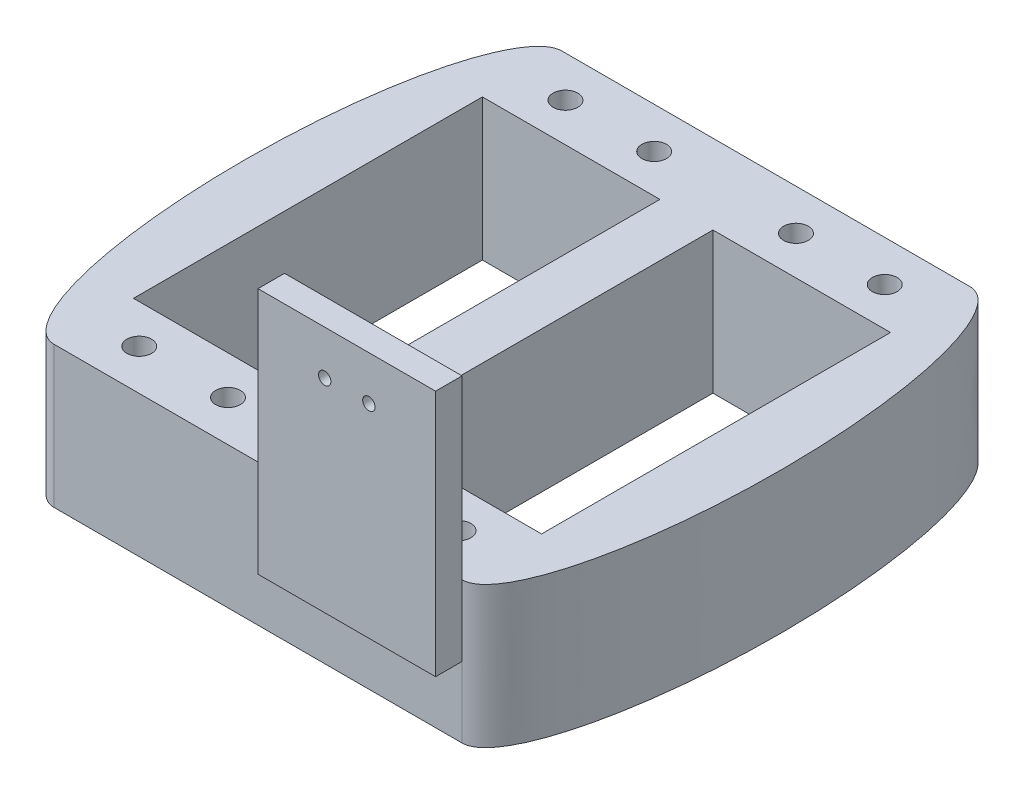
ISO-10303-21;
HEADER;
FILE_DESCRIPTION(('STEP AP214'),'2;1');
FILE_NAME('part.step','',(''),(''),'','','');
FILE_SCHEMA(('AUTOMOTIVE_DESIGN { 1 0 10303 214 1 1 1 1 }'));
ENDSEC;
DATA;
#1=APPLICATION_CONTEXT('core data for automotive mechanical design processes');
#2=APPLICATION_PROTOCOL_DEFINITION('international standard','automotive_design',2000,#1);
#3=PRODUCT_CONTEXT('',#1,'mechanical');
#4=PRODUCT('Part','Part','',(#3));
#5=PRODUCT_RELATED_PRODUCT_CATEGORY('part','',(#4));
#6=PRODUCT_DEFINITION_FORMATION('','',#4);
#7=PRODUCT_DEFINITION_CONTEXT('part definition',#1,'design');
#8=PRODUCT_DEFINITION('design','',#6,#7);
#9=PRODUCT_DEFINITION_SHAPE('','',#8);
#10=(LENGTH_UNIT() NAMED_UNIT(*) SI_UNIT(.MILLI.,.METRE.));
#11=(NAMED_UNIT(*) PLANE_ANGLE_UNIT() SI_UNIT($,.RADIAN.));
#12=(NAMED_UNIT(*) SI_UNIT($,.STERADIAN.) SOLID_ANGLE_UNIT());
#13=UNCERTAINTY_MEASURE_WITH_UNIT(LENGTH_MEASURE(1.E-05),#10,'distance_accuracy_value','');
#14=(GEOMETRIC_REPRESENTATION_CONTEXT(3) GLOBAL_UNCERTAINTY_ASSIGNED_CONTEXT((#13)) GLOBAL_UNIT_ASSIGNED_CONTEXT((#10,
#11,#12)) REPRESENTATION_CONTEXT('',''));
#15=CARTESIAN_POINT('',(0.,0.,0.));
#16=DIRECTION('',(0.,0.,1.));
#17=DIRECTION('',(1.,0.,0.));
#18=AXIS2_PLACEMENT_3D('',#15,#16,#17);
#19=CARTESIAN_POINT('',(0.,-8.,28.75));
#20=DIRECTION('',(0.,0.,1.));
#21=DIRECTION('',(1.,0.,0.));
#22=AXIS2_PLACEMENT_3D('',#19,#20,#21);
#23=PLANE('',#22);
#24=DIRECTION('',(-1.,0.,0.));
#25=VECTOR('',#24,1.);
#26=CARTESIAN_POINT('',(0.,0.,28.75));
#27=LINE('',#26,#25);
#28=CARTESIAN_POINT('',(10.05,0.,28.75));
#29=VERTEX_POINT('',#28);
#30=CARTESIAN_POINT('',(-10.05,0.,28.75));
#31=VERTEX_POINT('',#30);
#32=EDGE_CURVE('E339',#29,#31,#27,.T.);
#33=ORIENTED_EDGE('',*,*,#32,.T.);
#34=DIRECTION('',(0.,-1.,0.));
#35=VECTOR('',#34,1.);
#36=CARTESIAN_POINT('',(-10.05,28.,28.75));
#37=LINE('',#36,#35);
#38=CARTESIAN_POINT('',(-10.05,8.,28.75));
#39=VERTEX_POINT('',#38);
#40=EDGE_CURVE('E344',#39,#31,#37,.T.);
#41=ORIENTED_EDGE('',*,*,#40,.F.);
#42=DIRECTION('',(1.,0.,0.));
#43=VECTOR('',#42,1.);
#44=CARTESIAN_POINT('',(0.,8.,28.75));
#45=LINE('',#44,#43);
#46=CARTESIAN_POINT('',(-36.15,8.,28.75));
#47=VERTEX_POINT('',#46);
#48=EDGE_CURVE('E178',#47,#39,#45,.T.);
#49=ORIENTED_EDGE('',*,*,#48,.F.);
#50=DIRECTION('',(0.,1.,0.));
#51=VECTOR('',#50,1.);
#52=CARTESIAN_POINT('',(-36.15,-8.,28.75));
#53=LINE('',#52,#51);
#54=CARTESIAN_POINT('',(-36.15,-8.,28.75));
#55=VERTEX_POINT('',#54);
#56=EDGE_CURVE('E326',#55,#47,#53,.T.);
#57=ORIENTED_EDGE('',*,*,#56,.F.);
#58=DIRECTION('',(1.,0.,0.));
#59=VECTOR('',#58,1.);
#60=CARTESIAN_POINT('',(0.,-8.,28.75));
#61=LINE('',#60,#59);
#62=CARTESIAN_POINT('',(10.05,-8.,28.75));
#63=VERTEX_POINT('',#62);
#64=EDGE_CURVE('E242',#55,#63,#61,.T.);
#65=ORIENTED_EDGE('',*,*,#64,.T.);
#66=DIRECTION('',(0.,1.,0.));
#67=VECTOR('',#66,1.);
#68=CARTESIAN_POINT('',(10.05,-8.,28.75));
#69=LINE('',#68,#67);
#70=EDGE_CURVE('E37',#63,#29,#69,.T.);
#71=ORIENTED_EDGE('',*,*,#70,.T.);
#72=EDGE_LOOP('',(#33,#41,#49,#57,#65,#71));
#73=FACE_BOUND('',#72,.T.);
#74=ADVANCED_FACE('F34',(#73),#23,.T.);
#75=CARTESIAN_POINT('',(-36.15,-8.,0.));
#76=DIRECTION('',(1.,0.,0.));
#77=DIRECTION('',(0.,0.,-1.));
#78=AXIS2_PLACEMENT_3D('',#75,#76,#77);
#79=PLANE('',#78);
#80=DIRECTION('',(0.,1.,0.));
#81=VECTOR('',#80,1.);
#82=CARTESIAN_POINT('',(-36.15,-8.,-19.75));
#83=LINE('',#82,#81);
#84=CARTESIAN_POINT('',(-36.15,-8.,-19.75));
#85=VERTEX_POINT('',#84);
#86=CARTESIAN_POINT('',(-36.15,8.,-19.75));
#87=VERTEX_POINT('',#86);
#88=EDGE_CURVE('E316',#85,#87,#83,.T.);
#89=ORIENTED_EDGE('',*,*,#88,.T.);
#90=DIRECTION('',(0.,0.,-1.));
#91=VECTOR('',#90,1.);
#92=CARTESIAN_POINT('',(-36.15,8.,0.));
#93=LINE('',#92,#91);
#94=CARTESIAN_POINT('',(-36.15,8.,19.75));
#95=VERTEX_POINT('',#94);
#96=EDGE_CURVE('E206',#95,#87,#93,.T.);
#97=ORIENTED_EDGE('',*,*,#96,.F.);
#98=DIRECTION('',(0.,1.,0.));
#99=VECTOR('',#98,1.);
#100=CARTESIAN_POINT('',(-36.15,-8.,19.75));
#101=LINE('',#100,#99);
#102=CARTESIAN_POINT('',(-36.15,-8.,19.75));
#103=VERTEX_POINT('',#102);
#104=EDGE_CURVE('E11',#103,#95,#101,.T.);
#105=ORIENTED_EDGE('',*,*,#104,.F.);
#106=DIRECTION('',(0.,0.,-1.));
#107=VECTOR('',#106,1.);
#108=CARTESIAN_POINT('',(-36.15,-8.,0.));
#109=LINE('',#108,#107);
#110=EDGE_CURVE('E281',#103,#85,#109,.T.);
#111=ORIENTED_EDGE('',*,*,#110,.T.);
#112=EDGE_LOOP('',(#89,#97,#105,#111));
#113=FACE_BOUND('',#112,.T.);
#114=ADVANCED_FACE('F401',(#113),#79,.T.);
#115=CARTESIAN_POINT('',(0.,-8.,19.75));
#116=DIRECTION('',(0.,0.,1.));
#117=DIRECTION('',(1.,0.,0.));
#118=AXIS2_PLACEMENT_3D('',#115,#116,#117);
#119=PLANE('',#118);
#120=ORIENTED_EDGE('',*,*,#104,.T.);
#121=DIRECTION('',(1.,0.,0.));
#122=VECTOR('',#121,1.);
#123=CARTESIAN_POINT('',(0.,8.,19.75));
#124=LINE('',#123,#122);
#125=CARTESIAN_POINT('',(-16.05,8.,19.75));
#126=VERTEX_POINT('',#125);
#127=EDGE_CURVE('E215',#95,#126,#124,.T.);
#128=ORIENTED_EDGE('',*,*,#127,.T.);
#129=DIRECTION('',(0.,1.,0.));
#130=VECTOR('',#129,1.);
#131=CARTESIAN_POINT('',(-16.05,-8.,19.75));
#132=LINE('',#131,#130);
#133=CARTESIAN_POINT('',(-16.05,-8.,19.75));
#134=VERTEX_POINT('',#133);
#135=EDGE_CURVE('E42',#134,#126,#132,.T.);
#136=ORIENTED_EDGE('',*,*,#135,.F.);
#137=DIRECTION('',(1.,0.,0.));
#138=VECTOR('',#137,1.);
#139=CARTESIAN_POINT('',(0.,-8.,19.75));
#140=LINE('',#139,#138);
#141=EDGE_CURVE('E287',#103,#134,#140,.T.);
#142=ORIENTED_EDGE('',*,*,#141,.F.);
#143=EDGE_LOOP('',(#120,#128,#136,#142));
#144=FACE_BOUND('',#143,.T.);
#145=ADVANCED_FACE('F405',(#144),#119,.F.);
#146=CARTESIAN_POINT('',(-16.05,-8.,0.));
#147=DIRECTION('',(1.,0.,0.));
#148=DIRECTION('',(0.,0.,-1.));
#149=AXIS2_PLACEMENT_3D('',#146,#147,#148);
#150=PLANE('',#149);
#151=ORIENTED_EDGE('',*,*,#135,.T.);
#152=DIRECTION('',(0.,0.,-1.));
#153=VECTOR('',#152,1.);
#154=CARTESIAN_POINT('',(-16.05,8.,0.));
#155=LINE('',#154,#153);
#156=CARTESIAN_POINT('',(-16.05,8.,-19.75));
#157=VERTEX_POINT('',#156);
#158=EDGE_CURVE('E212',#126,#157,#155,.T.);
#159=ORIENTED_EDGE('',*,*,#158,.T.);
#160=DIRECTION('',(0.,1.,0.));
#161=VECTOR('',#160,1.);
#162=CARTESIAN_POINT('',(-16.05,-8.,-19.75));
#163=LINE('',#162,#161);
#164=CARTESIAN_POINT('',(-16.05,-8.,-19.75));
#165=VERTEX_POINT('',#164);
#166=EDGE_CURVE('E314',#165,#157,#163,.T.);
#167=ORIENTED_EDGE('',*,*,#166,.F.);
#168=DIRECTION('',(0.,0.,-1.));
#169=VECTOR('',#168,1.);
#170=CARTESIAN_POINT('',(-16.05,-8.,0.));
#171=LINE('',#170,#169);
#172=EDGE_CURVE('E56',#134,#165,#171,.T.);
#173=ORIENTED_EDGE('',*,*,#172,.F.);
#174=EDGE_LOOP('',(#151,#159,#167,#173));
#175=FACE_BOUND('',#174,.T.);
#176=ADVANCED_FACE('F410',(#175),#150,.F.);
#177=CARTESIAN_POINT('',(10.05,-8.,0.));
#178=DIRECTION('',(1.,0.,0.));
#179=DIRECTION('',(0.,0.,-1.));
#180=AXIS2_PLACEMENT_3D('',#177,#178,#179);
#181=PLANE('',#180);
#182=DIRECTION('',(0.,1.,0.));
#183=VECTOR('',#182,1.);
#184=CARTESIAN_POINT('',(10.05,-8.,19.75));
#185=LINE('',#184,#183);
#186=CARTESIAN_POINT('',(10.05,-8.,19.75));
#187=VERTEX_POINT('',#186);
#188=CARTESIAN_POINT('',(10.05,8.,19.75));
#189=VERTEX_POINT('',#188);
#190=EDGE_CURVE('E324',#187,#189,#185,.T.);
#191=ORIENTED_EDGE('',*,*,#190,.T.);
#192=DIRECTION('',(0.,0.,-1.));
#193=VECTOR('',#192,1.);
#194=CARTESIAN_POINT('',(10.05,8.,0.));
#195=LINE('',#194,#193);
#196=CARTESIAN_POINT('',(10.05,8.,-19.75));
#197=VERTEX_POINT('',#196);
#198=EDGE_CURVE('E194',#189,#197,#195,.T.);
#199=ORIENTED_EDGE('',*,*,#198,.T.);
#200=DIRECTION('',(0.,1.,0.));
#201=VECTOR('',#200,1.);
#202=CARTESIAN_POINT('',(10.05,-8.,-19.75));
#203=LINE('',#202,#201);
#204=CARTESIAN_POINT('',(10.05,-8.,-19.75));
#205=VERTEX_POINT('',#204);
#206=EDGE_CURVE('E318',#205,#197,#203,.T.);
#207=ORIENTED_EDGE('',*,*,#206,.F.);
#208=DIRECTION('',(0.,0.,-1.));
#209=VECTOR('',#208,1.);
#210=CARTESIAN_POINT('',(10.05,-8.,0.));
#211=LINE('',#210,#209);
#212=EDGE_CURVE('E272',#187,#205,#211,.T.);
#213=ORIENTED_EDGE('',*,*,#212,.F.);
#214=EDGE_LOOP('',(#191,#199,#207,#213));
#215=FACE_BOUND('',#214,.T.);
#216=ADVANCED_FACE('F266',(#215),#181,.F.);
#217=CARTESIAN_POINT('',(0.,-8.,-19.75));
#218=DIRECTION('',(0.,0.,1.));
#219=DIRECTION('',(1.,0.,0.));
#220=AXIS2_PLACEMENT_3D('',#217,#218,#219);
#221=PLANE('',#220);
#222=ORIENTED_EDGE('',*,*,#206,.T.);
#223=DIRECTION('',(1.,0.,0.));
#224=VECTOR('',#223,1.);
#225=CARTESIAN_POINT('',(0.,8.,-19.75));
#226=LINE('',#225,#224);
#227=CARTESIAN_POINT('',(-10.05,8.,-19.75));
#228=VERTEX_POINT('',#227);
#229=EDGE_CURVE('E203',#228,#197,#226,.T.);
#230=ORIENTED_EDGE('',*,*,#229,.F.);
#231=DIRECTION('',(0.,1.,0.));
#232=VECTOR('',#231,1.);
#233=CARTESIAN_POINT('',(-10.05,-8.,-19.75));
#234=LINE('',#233,#232);
#235=CARTESIAN_POINT('',(-10.05,-8.,-19.75));
#236=VERTEX_POINT('',#235);
#237=EDGE_CURVE('E320',#236,#228,#234,.T.);
#238=ORIENTED_EDGE('',*,*,#237,.F.);
#239=DIRECTION('',(1.,0.,0.));
#240=VECTOR('',#239,1.);
#241=CARTESIAN_POINT('',(0.,-8.,-19.75));
#242=LINE('',#241,#240);
#243=EDGE_CURVE('E278',#236,#205,#242,.T.);
#244=ORIENTED_EDGE('',*,*,#243,.T.);
#245=EDGE_LOOP('',(#222,#230,#238,#244));
#246=FACE_BOUND('',#245,.T.);
#247=ADVANCED_FACE('F417',(#246),#221,.T.);
#248=CARTESIAN_POINT('',(-10.05,-8.,0.));
#249=DIRECTION('',(-1.,0.,0.));
#250=DIRECTION('',(0.,0.,1.));
#251=AXIS2_PLACEMENT_3D('',#248,#249,#250);
#252=PLANE('',#251);
#253=ORIENTED_EDGE('',*,*,#237,.T.);
#254=DIRECTION('',(0.,0.,1.));
#255=VECTOR('',#254,1.);
#256=CARTESIAN_POINT('',(-10.05,8.,0.));
#257=LINE('',#256,#255);
#258=CARTESIAN_POINT('',(-10.05,8.,19.75));
#259=VERTEX_POINT('',#258);
#260=EDGE_CURVE('E200',#228,#259,#257,.T.);
#261=ORIENTED_EDGE('',*,*,#260,.T.);
#262=DIRECTION('',(0.,1.,0.));
#263=VECTOR('',#262,1.);
#264=CARTESIAN_POINT('',(-10.05,-8.,19.75));
#265=LINE('',#264,#263);
#266=CARTESIAN_POINT('',(-10.05,-8.,19.75));
#267=VERTEX_POINT('',#266);
#268=EDGE_CURVE('E322',#267,#259,#265,.T.);
#269=ORIENTED_EDGE('',*,*,#268,.F.);
#270=DIRECTION('',(0.,0.,1.));
#271=VECTOR('',#270,1.);
#272=CARTESIAN_POINT('',(-10.05,-8.,0.));
#273=LINE('',#272,#271);
#274=EDGE_CURVE('E276',#236,#267,#273,.T.);
#275=ORIENTED_EDGE('',*,*,#274,.F.);
#276=EDGE_LOOP('',(#253,#261,#269,#275));
#277=FACE_BOUND('',#276,.T.);
#278=ADVANCED_FACE('F264',(#277),#252,.F.);
#279=CARTESIAN_POINT('',(-36.15,-8.,0.));
#280=DIRECTION('',(0.,1.,0.));
#281=DIRECTION('',(0.,0.,-1.));
#282=AXIS2_PLACEMENT_3D('',#279,#280,#281);
#283=ELLIPSE('',#282,28.75,7.28237261118205);
#284=DIRECTION('',(0.,1.,0.));
#285=VECTOR('',#284,1.);
#286=SURFACE_OF_LINEAR_EXTRUSION('',#283,#285);
#287=ORIENTED_EDGE('',*,*,#56,.T.);
#288=CARTESIAN_POINT('',(-36.15,8.,0.));
#289=DIRECTION('',(0.,1.,0.));
#290=DIRECTION('',(0.,0.,-1.));
#291=AXIS2_PLACEMENT_3D('',#288,#289,#290);
#292=ELLIPSE('',#291,28.75,7.28237261118205);
#293=CARTESIAN_POINT('',(-36.15,8.,-28.75));
#294=VERTEX_POINT('',#293);
#295=EDGE_CURVE('E191',#294,#47,#292,.T.);
#296=ORIENTED_EDGE('',*,*,#295,.F.);
#297=DIRECTION('',(0.,1.,0.));
#298=VECTOR('',#297,1.);
#299=CARTESIAN_POINT('',(-36.15,-8.,-28.75));
#300=LINE('',#299,#298);
#301=CARTESIAN_POINT('',(-36.15,-8.,-28.75));
#302=VERTEX_POINT('',#301);
#303=EDGE_CURVE('E328',#302,#294,#300,.T.);
#304=ORIENTED_EDGE('',*,*,#303,.F.);
#305=EDGE_CURVE('E268',#302,#55,#283,.T.);
#306=ORIENTED_EDGE('',*,*,#305,.T.);
#307=EDGE_LOOP('',(#287,#296,#304,#306));
#308=FACE_BOUND('',#307,.T.);
#309=ADVANCED_FACE('F260',(#308),#286,.T.);
#310=CARTESIAN_POINT('',(0.,-8.,-28.75));
#311=DIRECTION('',(0.,0.,1.));
#312=DIRECTION('',(1.,0.,0.));
#313=AXIS2_PLACEMENT_3D('',#310,#311,#312);
#314=PLANE('',#313);
#315=ORIENTED_EDGE('',*,*,#303,.T.);
#316=DIRECTION('',(1.,0.,0.));
#317=VECTOR('',#316,1.);
#318=CARTESIAN_POINT('',(0.,8.,-28.75));
#319=LINE('',#318,#317);
#320=CARTESIAN_POINT('',(10.05,8.,-28.75));
#321=VERTEX_POINT('',#320);
#322=EDGE_CURVE('E188',#294,#321,#319,.T.);
#323=ORIENTED_EDGE('',*,*,#322,.T.);
#324=DIRECTION('',(0.,1.,0.));
#325=VECTOR('',#324,1.);
#326=CARTESIAN_POINT('',(10.05,-8.,-28.75));
#327=LINE('',#326,#325);
#328=CARTESIAN_POINT('',(10.05,-8.,-28.75));
#329=VERTEX_POINT('',#328);
#330=EDGE_CURVE('E329',#329,#321,#327,.T.);
#331=ORIENTED_EDGE('',*,*,#330,.F.);
#332=DIRECTION('',(1.,0.,0.));
#333=VECTOR('',#332,1.);
#334=CARTESIAN_POINT('',(0.,-8.,-28.75));
#335=LINE('',#334,#333);
#336=EDGE_CURVE('E248',#302,#329,#335,.T.);
#337=ORIENTED_EDGE('',*,*,#336,.F.);
#338=EDGE_LOOP('',(#315,#323,#331,#337));
#339=FACE_BOUND('',#338,.T.);
#340=ADVANCED_FACE('F256',(#339),#314,.F.);
#341=CARTESIAN_POINT('',(-5.025,-8.,-24.125));
#342=DIRECTION('',(0.,1.,0.));
#343=DIRECTION('',(0.,0.,1.));
#344=AXIS2_PLACEMENT_3D('',#341,#342,#343);
#345=CYLINDRICAL_SURFACE('',#344,1.4);
#346=CARTESIAN_POINT('',(-5.025,-8.,-24.125));
#347=DIRECTION('',(0.,1.,0.));
#348=DIRECTION('',(0.,0.,1.));
#349=AXIS2_PLACEMENT_3D('',#346,#347,#348);
#350=CIRCLE('',#349,1.4);
#351=CARTESIAN_POINT('',(-5.025,-8.,-22.725));
#352=VERTEX_POINT('',#351);
#353=EDGE_CURVE('E307',#352,#352,#350,.T.);
#354=ORIENTED_EDGE('',*,*,#353,.F.);
#355=EDGE_LOOP('',(#354));
#356=FACE_BOUND('',#355,.T.);
#357=CARTESIAN_POINT('',(-5.025,8.,-24.125));
#358=DIRECTION('',(0.,1.,0.));
#359=DIRECTION('',(0.,0.,1.));
#360=AXIS2_PLACEMENT_3D('',#357,#358,#359);
#361=CIRCLE('',#360,1.4);
#362=CARTESIAN_POINT('',(-5.025,8.,-22.725));
#363=VERTEX_POINT('',#362);
#364=EDGE_CURVE('E236',#363,#363,#361,.T.);
#365=ORIENTED_EDGE('',*,*,#364,.T.);
#366=EDGE_LOOP('',(#365));
#367=FACE_BOUND('',#366,.T.);
#368=ADVANCED_FACE('F259',(#356,#367),#345,.F.);
#369=CARTESIAN_POINT('',(-5.025,-8.,24.125));
#370=DIRECTION('',(0.,1.,0.));
#371=DIRECTION('',(0.,0.,1.));
#372=AXIS2_PLACEMENT_3D('',#369,#370,#371);
#373=CYLINDRICAL_SURFACE('',#372,1.4);
#374=CARTESIAN_POINT('',(-5.025,-8.,24.125));
#375=DIRECTION('',(0.,1.,0.));
#376=DIRECTION('',(0.,0.,1.));
#377=AXIS2_PLACEMENT_3D('',#374,#375,#376);
#378=CIRCLE('',#377,1.4);
#379=CARTESIAN_POINT('',(-5.025,-8.,25.525));
#380=VERTEX_POINT('',#379);
#381=EDGE_CURVE('E304',#380,#380,#378,.F.);
#382=ORIENTED_EDGE('',*,*,#381,.T.);
#383=EDGE_LOOP('',(#382));
#384=FACE_BOUND('',#383,.T.);
#385=CARTESIAN_POINT('',(-5.025,8.,24.125));
#386=DIRECTION('',(0.,1.,0.));
#387=DIRECTION('',(0.,0.,1.));
#388=AXIS2_PLACEMENT_3D('',#385,#386,#387);
#389=CIRCLE('',#388,1.4);
#390=CARTESIAN_POINT('',(-5.025,8.,25.525));
#391=VERTEX_POINT('',#390);
#392=EDGE_CURVE('E233',#391,#391,#389,.F.);
#393=ORIENTED_EDGE('',*,*,#392,.F.);
#394=EDGE_LOOP('',(#393));
#395=FACE_BOUND('',#394,.T.);
#396=ADVANCED_FACE('F484',(#384,#395),#373,.F.);
#397=CARTESIAN_POINT('',(5.025,-8.,24.125));
#398=DIRECTION('',(0.,1.,0.));
#399=DIRECTION('',(0.,0.,1.));
#400=AXIS2_PLACEMENT_3D('',#397,#398,#399);
#401=CYLINDRICAL_SURFACE('',#400,1.4);
#402=CARTESIAN_POINT('',(5.025,-8.,24.125));
#403=DIRECTION('',(0.,1.,0.));
#404=DIRECTION('',(0.,0.,1.));
#405=AXIS2_PLACEMENT_3D('',#402,#403,#404);
#406=CIRCLE('',#405,1.4);
#407=CARTESIAN_POINT('',(5.025,-8.,25.525));
#408=VERTEX_POINT('',#407);
#409=EDGE_CURVE('E301',#408,#408,#406,.T.);
#410=ORIENTED_EDGE('',*,*,#409,.F.);
#411=EDGE_LOOP('',(#410));
#412=FACE_BOUND('',#411,.T.);
#413=CARTESIAN_POINT('',(5.025,8.,24.125));
#414=DIRECTION('',(0.,1.,0.));
#415=DIRECTION('',(0.,0.,1.));
#416=AXIS2_PLACEMENT_3D('',#413,#414,#415);
#417=CIRCLE('',#416,1.4);
#418=CARTESIAN_POINT('',(5.025,8.,25.525));
#419=VERTEX_POINT('',#418);
#420=EDGE_CURVE('E230',#419,#419,#417,.T.);
#421=ORIENTED_EDGE('',*,*,#420,.T.);
#422=EDGE_LOOP('',(#421));
#423=FACE_BOUND('',#422,.T.);
#424=ADVANCED_FACE('F488',(#412,#423),#401,.F.);
#425=CARTESIAN_POINT('',(-31.125,-8.,24.125));
#426=DIRECTION('',(0.,1.,0.));
#427=DIRECTION('',(0.,0.,1.));
#428=AXIS2_PLACEMENT_3D('',#425,#426,#427);
#429=CYLINDRICAL_SURFACE('',#428,1.4);
#430=CARTESIAN_POINT('',(-31.125,-8.,24.125));
#431=DIRECTION('',(0.,1.,0.));
#432=DIRECTION('',(0.,0.,1.));
#433=AXIS2_PLACEMENT_3D('',#430,#431,#432);
#434=CIRCLE('',#433,1.4);
#435=CARTESIAN_POINT('',(-31.125,-8.,25.525));
#436=VERTEX_POINT('',#435);
#437=EDGE_CURVE('E298',#436,#436,#434,.F.);
#438=ORIENTED_EDGE('',*,*,#437,.T.);
#439=EDGE_LOOP('',(#438));
#440=FACE_BOUND('',#439,.T.);
#441=CARTESIAN_POINT('',(-31.125,8.,24.125));
#442=DIRECTION('',(0.,1.,0.));
#443=DIRECTION('',(0.,0.,1.));
#444=AXIS2_PLACEMENT_3D('',#441,#442,#443);
#445=CIRCLE('',#444,1.4);
#446=CARTESIAN_POINT('',(-31.125,8.,25.525));
#447=VERTEX_POINT('',#446);
#448=EDGE_CURVE('E227',#447,#447,#445,.F.);
#449=ORIENTED_EDGE('',*,*,#448,.F.);
#450=EDGE_LOOP('',(#449));
#451=FACE_BOUND('',#450,.T.);
#452=ADVANCED_FACE('F492',(#440,#451),#429,.F.);
#453=CARTESIAN_POINT('',(-21.075,-8.,24.125));
#454=DIRECTION('',(0.,1.,0.));
#455=DIRECTION('',(0.,0.,1.));
#456=AXIS2_PLACEMENT_3D('',#453,#454,#455);
#457=CYLINDRICAL_SURFACE('',#456,1.4);
#458=CARTESIAN_POINT('',(-21.075,-8.,24.125));
#459=DIRECTION('',(0.,1.,0.));
#460=DIRECTION('',(0.,0.,1.));
#461=AXIS2_PLACEMENT_3D('',#458,#459,#460);
#462=CIRCLE('',#461,1.4);
#463=CARTESIAN_POINT('',(-21.075,-8.,25.525));
#464=VERTEX_POINT('',#463);
#465=EDGE_CURVE('E295',#464,#464,#462,.T.);
#466=ORIENTED_EDGE('',*,*,#465,.F.);
#467=EDGE_LOOP('',(#466));
#468=FACE_BOUND('',#467,.T.);
#469=CARTESIAN_POINT('',(-21.075,8.,24.125));
#470=DIRECTION('',(0.,1.,0.));
#471=DIRECTION('',(0.,0.,1.));
#472=AXIS2_PLACEMENT_3D('',#469,#470,#471);
#473=CIRCLE('',#472,1.4);
#474=CARTESIAN_POINT('',(-21.075,8.,25.525));
#475=VERTEX_POINT('',#474);
#476=EDGE_CURVE('E224',#475,#475,#473,.T.);
#477=ORIENTED_EDGE('',*,*,#476,.T.);
#478=EDGE_LOOP('',(#477));
#479=FACE_BOUND('',#478,.T.);
#480=ADVANCED_FACE('F496',(#468,#479),#457,.F.);
#481=CARTESIAN_POINT('',(-21.075,-8.,-24.125));
#482=DIRECTION('',(0.,1.,0.));
#483=DIRECTION('',(0.,0.,1.));
#484=AXIS2_PLACEMENT_3D('',#481,#482,#483);
#485=CYLINDRICAL_SURFACE('',#484,1.4);
#486=CARTESIAN_POINT('',(-21.075,-8.,-24.125));
#487=DIRECTION('',(0.,1.,0.));
#488=DIRECTION('',(0.,0.,1.));
#489=AXIS2_PLACEMENT_3D('',#486,#487,#488);
#490=CIRCLE('',#489,1.4);
#491=CARTESIAN_POINT('',(-21.075,-8.,-22.725));
#492=VERTEX_POINT('',#491);
#493=EDGE_CURVE('E292',#492,#492,#490,.F.);
#494=ORIENTED_EDGE('',*,*,#493,.T.);
#495=EDGE_LOOP('',(#494));
#496=FACE_BOUND('',#495,.T.);
#497=CARTESIAN_POINT('',(-21.075,8.,-24.125));
#498=DIRECTION('',(0.,1.,0.));
#499=DIRECTION('',(0.,0.,1.));
#500=AXIS2_PLACEMENT_3D('',#497,#498,#499);
#501=CIRCLE('',#500,1.4);
#502=CARTESIAN_POINT('',(-21.075,8.,-22.725));
#503=VERTEX_POINT('',#502);
#504=EDGE_CURVE('E221',#503,#503,#501,.F.);
#505=ORIENTED_EDGE('',*,*,#504,.F.);
#506=EDGE_LOOP('',(#505));
#507=FACE_BOUND('',#506,.T.);
#508=ADVANCED_FACE('F500',(#496,#507),#485,.F.);
#509=CARTESIAN_POINT('',(-31.125,-8.,-24.125));
#510=DIRECTION('',(0.,1.,0.));
#511=DIRECTION('',(0.,0.,1.));
#512=AXIS2_PLACEMENT_3D('',#509,#510,#511);
#513=CYLINDRICAL_SURFACE('',#512,1.4);
#514=CARTESIAN_POINT('',(-31.125,-8.,-24.125));
#515=DIRECTION('',(0.,1.,0.));
#516=DIRECTION('',(0.,0.,1.));
#517=AXIS2_PLACEMENT_3D('',#514,#515,#516);
#518=CIRCLE('',#517,1.4);
#519=CARTESIAN_POINT('',(-31.125,-8.,-22.725));
#520=VERTEX_POINT('',#519);
#521=EDGE_CURVE('E289',#520,#520,#518,.T.);
#522=ORIENTED_EDGE('',*,*,#521,.F.);
#523=EDGE_LOOP('',(#522));
#524=FACE_BOUND('',#523,.T.);
#525=CARTESIAN_POINT('',(-31.125,8.,-24.125));
#526=DIRECTION('',(0.,1.,0.));
#527=DIRECTION('',(0.,0.,1.));
#528=AXIS2_PLACEMENT_3D('',#525,#526,#527);
#529=CIRCLE('',#528,1.4);
#530=CARTESIAN_POINT('',(-31.125,8.,-22.725));
#531=VERTEX_POINT('',#530);
#532=EDGE_CURVE('E218',#531,#531,#529,.T.);
#533=ORIENTED_EDGE('',*,*,#532,.T.);
#534=EDGE_LOOP('',(#533));
#535=FACE_BOUND('',#534,.T.);
#536=ADVANCED_FACE('F428',(#524,#535),#513,.F.);
#537=CARTESIAN_POINT('',(0.,-8.,-19.75));
#538=DIRECTION('',(0.,0.,1.));
#539=DIRECTION('',(1.,0.,0.));
#540=AXIS2_PLACEMENT_3D('',#537,#538,#539);
#541=PLANE('',#540);
#542=ORIENTED_EDGE('',*,*,#166,.T.);
#543=DIRECTION('',(1.,0.,0.));
#544=VECTOR('',#543,1.);
#545=CARTESIAN_POINT('',(0.,8.,-19.75));
#546=LINE('',#545,#544);
#547=EDGE_CURVE('E209',#87,#157,#546,.T.);
#548=ORIENTED_EDGE('',*,*,#547,.F.);
#549=ORIENTED_EDGE('',*,*,#88,.F.);
#550=DIRECTION('',(1.,0.,0.));
#551=VECTOR('',#550,1.);
#552=CARTESIAN_POINT('',(0.,-8.,-19.75));
#553=LINE('',#552,#551);
#554=EDGE_CURVE('E283',#85,#165,#553,.T.);
#555=ORIENTED_EDGE('',*,*,#554,.T.);
#556=EDGE_LOOP('',(#542,#548,#549,#555));
#557=FACE_BOUND('',#556,.T.);
#558=ADVANCED_FACE('F415',(#557),#541,.T.);
#559=CARTESIAN_POINT('',(0.,-8.,19.75));
#560=DIRECTION('',(0.,0.,1.));
#561=DIRECTION('',(1.,0.,0.));
#562=AXIS2_PLACEMENT_3D('',#559,#560,#561);
#563=PLANE('',#562);
#564=ORIENTED_EDGE('',*,*,#268,.T.);
#565=DIRECTION('',(1.,0.,0.));
#566=VECTOR('',#565,1.);
#567=CARTESIAN_POINT('',(0.,8.,19.75));
#568=LINE('',#567,#566);
#569=EDGE_CURVE('E197',#259,#189,#568,.T.);
#570=ORIENTED_EDGE('',*,*,#569,.T.);
#571=ORIENTED_EDGE('',*,*,#190,.F.);
#572=DIRECTION('',(1.,0.,0.));
#573=VECTOR('',#572,1.);
#574=CARTESIAN_POINT('',(0.,-8.,19.75));
#575=LINE('',#574,#573);
#576=EDGE_CURVE('E274',#267,#187,#575,.T.);
#577=ORIENTED_EDGE('',*,*,#576,.F.);
#578=EDGE_LOOP('',(#564,#570,#571,#577));
#579=FACE_BOUND('',#578,.T.);
#580=ADVANCED_FACE('F254',(#579),#563,.F.);
#581=CARTESIAN_POINT('',(10.05,-8.,0.));
#582=DIRECTION('',(0.,-1.,0.));
#583=DIRECTION('',(0.,0.,-1.));
#584=AXIS2_PLACEMENT_3D('',#581,#582,#583);
#585=ELLIPSE('',#584,28.75,7.28237261118205);
#586=DIRECTION('',(0.,1.,0.));
#587=VECTOR('',#586,1.);
#588=SURFACE_OF_LINEAR_EXTRUSION('',#585,#587);
#589=ORIENTED_EDGE('',*,*,#330,.T.);
#590=CARTESIAN_POINT('',(10.05,8.,0.));
#591=DIRECTION('',(0.,-1.,0.));
#592=DIRECTION('',(0.,0.,-1.));
#593=AXIS2_PLACEMENT_3D('',#590,#591,#592);
#594=ELLIPSE('',#593,28.75,7.28237261118205);
#595=CARTESIAN_POINT('',(10.05,8.,28.75));
#596=VERTEX_POINT('',#595);
#597=EDGE_CURVE('E185',#321,#596,#594,.T.);
#598=ORIENTED_EDGE('',*,*,#597,.T.);
#599=DIRECTION('',(0.,-1.,0.));
#600=VECTOR('',#599,1.);
#601=CARTESIAN_POINT('',(10.05,28.,28.75));
#602=LINE('',#601,#600);
#603=EDGE_CURVE('E180',#596,#29,#602,.T.);
#604=ORIENTED_EDGE('',*,*,#603,.T.);
#605=ORIENTED_EDGE('',*,*,#70,.F.);
#606=EDGE_CURVE('E245',#329,#63,#585,.T.);
#607=ORIENTED_EDGE('',*,*,#606,.F.);
#608=EDGE_LOOP('',(#589,#598,#604,#605,#607));
#609=FACE_BOUND('',#608,.T.);
#610=ADVANCED_FACE('F250',(#609),#588,.F.);
#611=CARTESIAN_POINT('',(5.025,-8.,-24.125));
#612=DIRECTION('',(0.,1.,0.));
#613=DIRECTION('',(0.,0.,1.));
#614=AXIS2_PLACEMENT_3D('',#611,#612,#613);
#615=CYLINDRICAL_SURFACE('',#614,1.4);
#616=CARTESIAN_POINT('',(5.025,-8.,-24.125));
#617=DIRECTION('',(0.,1.,0.));
#618=DIRECTION('',(0.,0.,1.));
#619=AXIS2_PLACEMENT_3D('',#616,#617,#618);
#620=CIRCLE('',#619,1.4);
#621=CARTESIAN_POINT('',(5.025,-8.,-22.725));
#622=VERTEX_POINT('',#621);
#623=EDGE_CURVE('E310',#622,#622,#620,.F.);
#624=ORIENTED_EDGE('',*,*,#623,.T.);
#625=EDGE_LOOP('',(#624));
#626=FACE_BOUND('',#625,.T.);
#627=CARTESIAN_POINT('',(5.025,8.,-24.125));
#628=DIRECTION('',(0.,1.,0.));
#629=DIRECTION('',(0.,0.,1.));
#630=AXIS2_PLACEMENT_3D('',#627,#628,#629);
#631=CIRCLE('',#630,1.4);
#632=CARTESIAN_POINT('',(5.025,8.,-22.725));
#633=VERTEX_POINT('',#632);
#634=EDGE_CURVE('E239',#633,#633,#631,.F.);
#635=ORIENTED_EDGE('',*,*,#634,.F.);
#636=EDGE_LOOP('',(#635));
#637=FACE_BOUND('',#636,.T.);
#638=ADVANCED_FACE('F253',(#626,#637),#615,.F.);
#639=CARTESIAN_POINT('',(0.,-8.,0.));
#640=DIRECTION('',(0.,1.,0.));
#641=DIRECTION('',(0.,0.,1.));
#642=AXIS2_PLACEMENT_3D('',#639,#640,#641);
#643=PLANE('',#642);
#644=ORIENTED_EDGE('',*,*,#64,.F.);
#645=ORIENTED_EDGE('',*,*,#305,.F.);
#646=ORIENTED_EDGE('',*,*,#336,.T.);
#647=ORIENTED_EDGE('',*,*,#606,.T.);
#648=EDGE_LOOP('',(#644,#645,#646,#647));
#649=FACE_BOUND('',#648,.T.);
#650=ORIENTED_EDGE('',*,*,#212,.T.);
#651=ORIENTED_EDGE('',*,*,#243,.F.);
#652=ORIENTED_EDGE('',*,*,#274,.T.);
#653=ORIENTED_EDGE('',*,*,#576,.T.);
#654=EDGE_LOOP('',(#650,#651,#652,#653));
#655=FACE_BOUND('',#654,.T.);
#656=ORIENTED_EDGE('',*,*,#110,.F.);
#657=ORIENTED_EDGE('',*,*,#141,.T.);
#658=ORIENTED_EDGE('',*,*,#172,.T.);
#659=ORIENTED_EDGE('',*,*,#554,.F.);
#660=EDGE_LOOP('',(#656,#657,#658,#659));
#661=FACE_BOUND('',#660,.T.);
#662=ORIENTED_EDGE('',*,*,#521,.T.);
#663=EDGE_LOOP('',(#662));
#664=FACE_BOUND('',#663,.T.);
#665=ORIENTED_EDGE('',*,*,#493,.F.);
#666=EDGE_LOOP('',(#665));
#667=FACE_BOUND('',#666,.T.);
#668=ORIENTED_EDGE('',*,*,#465,.T.);
#669=EDGE_LOOP('',(#668));
#670=FACE_BOUND('',#669,.T.);
#671=ORIENTED_EDGE('',*,*,#437,.F.);
#672=EDGE_LOOP('',(#671));
#673=FACE_BOUND('',#672,.T.);
#674=ORIENTED_EDGE('',*,*,#409,.T.);
#675=EDGE_LOOP('',(#674));
#676=FACE_BOUND('',#675,.T.);
#677=ORIENTED_EDGE('',*,*,#381,.F.);
#678=EDGE_LOOP('',(#677));
#679=FACE_BOUND('',#678,.T.);
#680=ORIENTED_EDGE('',*,*,#353,.T.);
#681=EDGE_LOOP('',(#680));
#682=FACE_BOUND('',#681,.T.);
#683=ORIENTED_EDGE('',*,*,#623,.F.);
#684=EDGE_LOOP('',(#683));
#685=FACE_BOUND('',#684,.T.);
#686=ADVANCED_FACE('F444',(#649,#655,#661,#664,#667,#670,#673,#676,#679,#682,#685),#643,.F.);
#687=CARTESIAN_POINT('',(0.,8.,0.));
#688=DIRECTION('',(0.,1.,0.));
#689=DIRECTION('',(0.,0.,1.));
#690=AXIS2_PLACEMENT_3D('',#687,#688,#689);
#691=PLANE('',#690);
#692=ORIENTED_EDGE('',*,*,#48,.T.);
#693=EDGE_CURVE('E175',#39,#596,#45,.T.);
#694=ORIENTED_EDGE('',*,*,#693,.T.);
#695=ORIENTED_EDGE('',*,*,#597,.F.);
#696=ORIENTED_EDGE('',*,*,#322,.F.);
#697=ORIENTED_EDGE('',*,*,#295,.T.);
#698=EDGE_LOOP('',(#692,#694,#695,#696,#697));
#699=FACE_BOUND('',#698,.T.);
#700=ORIENTED_EDGE('',*,*,#198,.F.);
#701=ORIENTED_EDGE('',*,*,#569,.F.);
#702=ORIENTED_EDGE('',*,*,#260,.F.);
#703=ORIENTED_EDGE('',*,*,#229,.T.);
#704=EDGE_LOOP('',(#700,#701,#702,#703));
#705=FACE_BOUND('',#704,.T.);
#706=ORIENTED_EDGE('',*,*,#96,.T.);
#707=ORIENTED_EDGE('',*,*,#547,.T.);
#708=ORIENTED_EDGE('',*,*,#158,.F.);
#709=ORIENTED_EDGE('',*,*,#127,.F.);
#710=EDGE_LOOP('',(#706,#707,#708,#709));
#711=FACE_BOUND('',#710,.T.);
#712=ORIENTED_EDGE('',*,*,#532,.F.);
#713=EDGE_LOOP('',(#712));
#714=FACE_BOUND('',#713,.T.);
#715=ORIENTED_EDGE('',*,*,#504,.T.);
#716=EDGE_LOOP('',(#715));
#717=FACE_BOUND('',#716,.T.);
#718=ORIENTED_EDGE('',*,*,#476,.F.);
#719=EDGE_LOOP('',(#718));
#720=FACE_BOUND('',#719,.T.);
#721=ORIENTED_EDGE('',*,*,#448,.T.);
#722=EDGE_LOOP('',(#721));
#723=FACE_BOUND('',#722,.T.);
#724=ORIENTED_EDGE('',*,*,#420,.F.);
#725=EDGE_LOOP('',(#724));
#726=FACE_BOUND('',#725,.T.);
#727=ORIENTED_EDGE('',*,*,#392,.T.);
#728=EDGE_LOOP('',(#727));
#729=FACE_BOUND('',#728,.T.);
#730=ORIENTED_EDGE('',*,*,#364,.F.);
#731=EDGE_LOOP('',(#730));
#732=FACE_BOUND('',#731,.T.);
#733=ORIENTED_EDGE('',*,*,#634,.T.);
#734=EDGE_LOOP('',(#733));
#735=FACE_BOUND('',#734,.T.);
#736=ADVANCED_FACE('F381',(#699,#705,#711,#714,#717,#720,#723,#726,#729,#732,#735),#691,.T.);
#737=CARTESIAN_POINT('',(0.,28.,31.75));
#738=DIRECTION('',(0.,0.,-1.));
#739=DIRECTION('',(-1.,0.,0.));
#740=AXIS2_PLACEMENT_3D('',#737,#738,#739);
#741=PLANE('',#740);
#742=CARTESIAN_POINT('',(2.50000000000001,23.,31.75));
#743=DIRECTION('',(0.,0.,-1.));
#744=DIRECTION('',(-1.,0.,0.));
#745=AXIS2_PLACEMENT_3D('',#742,#743,#744);
#746=CIRCLE('',#745,0.699999999999999);
#747=CARTESIAN_POINT('',(1.80000000000001,23.,31.75));
#748=VERTEX_POINT('',#747);
#749=EDGE_CURVE('E355',#748,#748,#746,.T.);
#750=ORIENTED_EDGE('',*,*,#749,.T.);
#751=EDGE_LOOP('',(#750));
#752=FACE_BOUND('',#751,.T.);
#753=CARTESIAN_POINT('',(-2.49999999999999,23.,31.75));
#754=DIRECTION('',(0.,0.,-1.));
#755=DIRECTION('',(-1.,0.,0.));
#756=AXIS2_PLACEMENT_3D('',#753,#754,#755);
#757=CIRCLE('',#756,0.7);
#758=CARTESIAN_POINT('',(-3.19999999999999,23.,31.75));
#759=VERTEX_POINT('',#758);
#760=EDGE_CURVE('E360',#759,#759,#757,.T.);
#761=ORIENTED_EDGE('',*,*,#760,.T.);
#762=EDGE_LOOP('',(#761));
#763=FACE_BOUND('',#762,.T.);
#764=DIRECTION('',(1.,0.,0.));
#765=VECTOR('',#764,1.);
#766=CARTESIAN_POINT('',(0.,0.,31.75));
#767=LINE('',#766,#765);
#768=CARTESIAN_POINT('',(-10.05,0.,31.75));
#769=VERTEX_POINT('',#768);
#770=CARTESIAN_POINT('',(10.05,0.,31.75));
#771=VERTEX_POINT('',#770);
#772=EDGE_CURVE('E174',#769,#771,#767,.T.);
#773=ORIENTED_EDGE('',*,*,#772,.T.);
#774=DIRECTION('',(0.,-1.,0.));
#775=VECTOR('',#774,1.);
#776=CARTESIAN_POINT('',(10.05,28.,31.75));
#777=LINE('',#776,#775);
#778=CARTESIAN_POINT('',(10.05,28.,31.75));
#779=VERTEX_POINT('',#778);
#780=EDGE_CURVE('E154',#779,#771,#777,.T.);
#781=ORIENTED_EDGE('',*,*,#780,.F.);
#782=DIRECTION('',(1.,0.,0.));
#783=VECTOR('',#782,1.);
#784=CARTESIAN_POINT('',(0.,28.,31.75));
#785=LINE('',#784,#783);
#786=CARTESIAN_POINT('',(-10.05,28.,31.75));
#787=VERTEX_POINT('',#786);
#788=EDGE_CURVE('E161',#787,#779,#785,.T.);
#789=ORIENTED_EDGE('',*,*,#788,.F.);
#790=DIRECTION('',(0.,-1.,0.));
#791=VECTOR('',#790,1.);
#792=CARTESIAN_POINT('',(-10.05,28.,31.75));
#793=LINE('',#792,#791);
#794=EDGE_CURVE('E347',#787,#769,#793,.T.);
#795=ORIENTED_EDGE('',*,*,#794,.T.);
#796=EDGE_LOOP('',(#773,#781,#789,#795));
#797=FACE_BOUND('',#796,.T.);
#798=ADVANCED_FACE('F172',(#752,#763,#797),#741,.F.);
#799=CARTESIAN_POINT('',(10.05,28.,0.));
#800=DIRECTION('',(-1.,0.,0.));
#801=DIRECTION('',(0.,0.,1.));
#802=AXIS2_PLACEMENT_3D('',#799,#800,#801);
#803=PLANE('',#802);
#804=DIRECTION('',(0.,0.,-1.));
#805=VECTOR('',#804,1.);
#806=CARTESIAN_POINT('',(10.05,0.,0.));
#807=LINE('',#806,#805);
#808=EDGE_CURVE('E352',#771,#29,#807,.T.);
#809=ORIENTED_EDGE('',*,*,#808,.T.);
#810=ORIENTED_EDGE('',*,*,#603,.F.);
#811=CARTESIAN_POINT('',(10.05,28.,28.75));
#812=VERTEX_POINT('',#811);
#813=EDGE_CURVE('E157',#812,#596,#602,.T.);
#814=ORIENTED_EDGE('',*,*,#813,.F.);
#815=DIRECTION('',(0.,0.,-1.));
#816=VECTOR('',#815,1.);
#817=CARTESIAN_POINT('',(10.05,28.,0.));
#818=LINE('',#817,#816);
#819=EDGE_CURVE('E150',#779,#812,#818,.T.);
#820=ORIENTED_EDGE('',*,*,#819,.F.);
#821=ORIENTED_EDGE('',*,*,#780,.T.);
#822=EDGE_LOOP('',(#809,#810,#814,#820,#821));
#823=FACE_BOUND('',#822,.T.);
#824=ADVANCED_FACE('F152',(#823),#803,.F.);
#825=CARTESIAN_POINT('',(0.,28.,28.75));
#826=DIRECTION('',(0.,0.,1.));
#827=DIRECTION('',(1.,0.,0.));
#828=AXIS2_PLACEMENT_3D('',#825,#826,#827);
#829=PLANE('',#828);
#830=CARTESIAN_POINT('',(2.50000000000001,23.,28.75));
#831=DIRECTION('',(0.,0.,-1.));
#832=DIRECTION('',(-1.,0.,0.));
#833=AXIS2_PLACEMENT_3D('',#830,#831,#832);
#834=CIRCLE('',#833,0.699999999999999);
#835=CARTESIAN_POINT('',(1.80000000000001,23.,28.75));
#836=VERTEX_POINT('',#835);
#837=EDGE_CURVE('E363',#836,#836,#834,.T.);
#838=ORIENTED_EDGE('',*,*,#837,.F.);
#839=EDGE_LOOP('',(#838));
#840=FACE_BOUND('',#839,.T.);
#841=CARTESIAN_POINT('',(-2.49999999999999,23.,28.75));
#842=DIRECTION('',(0.,0.,-1.));
#843=DIRECTION('',(1.,0.,0.));
#844=AXIS2_PLACEMENT_3D('',#841,#842,#843);
#845=CIRCLE('',#844,0.7);
#846=CARTESIAN_POINT('',(-1.79999999999999,23.,28.75));
#847=VERTEX_POINT('',#846);
#848=EDGE_CURVE('E364',#847,#847,#845,.T.);
#849=ORIENTED_EDGE('',*,*,#848,.F.);
#850=EDGE_LOOP('',(#849));
#851=FACE_BOUND('',#850,.T.);
#852=ORIENTED_EDGE('',*,*,#693,.F.);
#853=CARTESIAN_POINT('',(-10.05,28.,28.75));
#854=VERTEX_POINT('',#853);
#855=EDGE_CURVE('E342',#854,#39,#37,.T.);
#856=ORIENTED_EDGE('',*,*,#855,.F.);
#857=DIRECTION('',(-1.,0.,0.));
#858=VECTOR('',#857,1.);
#859=CARTESIAN_POINT('',(0.,28.,28.75));
#860=LINE('',#859,#858);
#861=EDGE_CURVE('E160',#812,#854,#860,.T.);
#862=ORIENTED_EDGE('',*,*,#861,.F.);
#863=ORIENTED_EDGE('',*,*,#813,.T.);
#864=EDGE_LOOP('',(#852,#856,#862,#863));
#865=FACE_BOUND('',#864,.T.);
#866=ADVANCED_FACE('F373',(#840,#851,#865),#829,.F.);
#867=CARTESIAN_POINT('',(-10.05,28.,0.));
#868=DIRECTION('',(1.,0.,0.));
#869=DIRECTION('',(0.,0.,-1.));
#870=AXIS2_PLACEMENT_3D('',#867,#868,#869);
#871=PLANE('',#870);
#872=DIRECTION('',(0.,0.,1.));
#873=VECTOR('',#872,1.);
#874=CARTESIAN_POINT('',(-10.05,0.,0.));
#875=LINE('',#874,#873);
#876=EDGE_CURVE('E170',#31,#769,#875,.T.);
#877=ORIENTED_EDGE('',*,*,#876,.T.);
#878=ORIENTED_EDGE('',*,*,#794,.F.);
#879=DIRECTION('',(0.,0.,1.));
#880=VECTOR('',#879,1.);
#881=CARTESIAN_POINT('',(-10.05,28.,0.));
#882=LINE('',#881,#880);
#883=EDGE_CURVE('E166',#854,#787,#882,.T.);
#884=ORIENTED_EDGE('',*,*,#883,.F.);
#885=ORIENTED_EDGE('',*,*,#855,.T.);
#886=ORIENTED_EDGE('',*,*,#40,.T.);
#887=EDGE_LOOP('',(#877,#878,#884,#885,#886));
#888=FACE_BOUND('',#887,.T.);
#889=ADVANCED_FACE('F376',(#888),#871,.F.);
#890=CARTESIAN_POINT('',(0.,28.,0.));
#891=DIRECTION('',(0.,1.,0.));
#892=DIRECTION('',(0.,0.,1.));
#893=AXIS2_PLACEMENT_3D('',#890,#891,#892);
#894=PLANE('',#893);
#895=ORIENTED_EDGE('',*,*,#788,.T.);
#896=ORIENTED_EDGE('',*,*,#819,.T.);
#897=ORIENTED_EDGE('',*,*,#861,.T.);
#898=ORIENTED_EDGE('',*,*,#883,.T.);
#899=EDGE_LOOP('',(#895,#896,#897,#898));
#900=FACE_BOUND('',#899,.T.);
#901=ADVANCED_FACE('F164',(#900),#894,.T.);
#902=CARTESIAN_POINT('',(0.,0.,0.));
#903=DIRECTION('',(0.,1.,0.));
#904=DIRECTION('',(0.,0.,1.));
#905=AXIS2_PLACEMENT_3D('',#902,#903,#904);
#906=PLANE('',#905);
#907=ORIENTED_EDGE('',*,*,#772,.F.);
#908=ORIENTED_EDGE('',*,*,#876,.F.);
#909=ORIENTED_EDGE('',*,*,#32,.F.);
#910=ORIENTED_EDGE('',*,*,#808,.F.);
#911=EDGE_LOOP('',(#907,#908,#909,#910));
#912=FACE_BOUND('',#911,.T.);
#913=ADVANCED_FACE('F388',(#912),#906,.F.);
#914=CARTESIAN_POINT('',(-2.49999999999998,23.,56.75));
#915=DIRECTION('',(0.,0.,-1.));
#916=DIRECTION('',(-1.,0.,0.));
#917=AXIS2_PLACEMENT_3D('',#914,#915,#916);
#918=CYLINDRICAL_SURFACE('',#917,0.7);
#919=ORIENTED_EDGE('',*,*,#848,.T.);
#920=EDGE_LOOP('',(#919));
#921=FACE_BOUND('',#920,.T.);
#922=ORIENTED_EDGE('',*,*,#760,.F.);
#923=EDGE_LOOP('',(#922));
#924=FACE_BOUND('',#923,.T.);
#925=ADVANCED_FACE('F390',(#921,#924),#918,.F.);
#926=CARTESIAN_POINT('',(2.50000000000002,23.,56.75));
#927=DIRECTION('',(0.,0.,-1.));
#928=DIRECTION('',(-1.,0.,0.));
#929=AXIS2_PLACEMENT_3D('',#926,#927,#928);
#930=CYLINDRICAL_SURFACE('',#929,0.699999999999999);
#931=ORIENTED_EDGE('',*,*,#837,.T.);
#932=EDGE_LOOP('',(#931));
#933=FACE_BOUND('',#932,.T.);
#934=ORIENTED_EDGE('',*,*,#749,.F.);
#935=EDGE_LOOP('',(#934));
#936=FACE_BOUND('',#935,.T.);
#937=ADVANCED_FACE('F370',(#933,#936),#930,.F.);
#938=CLOSED_SHELL('',(#74,#114,#145,#176,#216,#247,#278,#309,#340,#368,#396,#424,#452,#480,#508,
#536,#558,#580,#610,#638,#686,#736,#798,#824,#866,#889,#901,#913,#925,#937));
#939=MANIFOLD_SOLID_BREP('B2',#938);
#940=ADVANCED_BREP_SHAPE_REPRESENTATION('',(#18,#939),#14);
#941=SHAPE_DEFINITION_REPRESENTATION(#9,#940);
ENDSEC;
END-ISO-10303-21;
